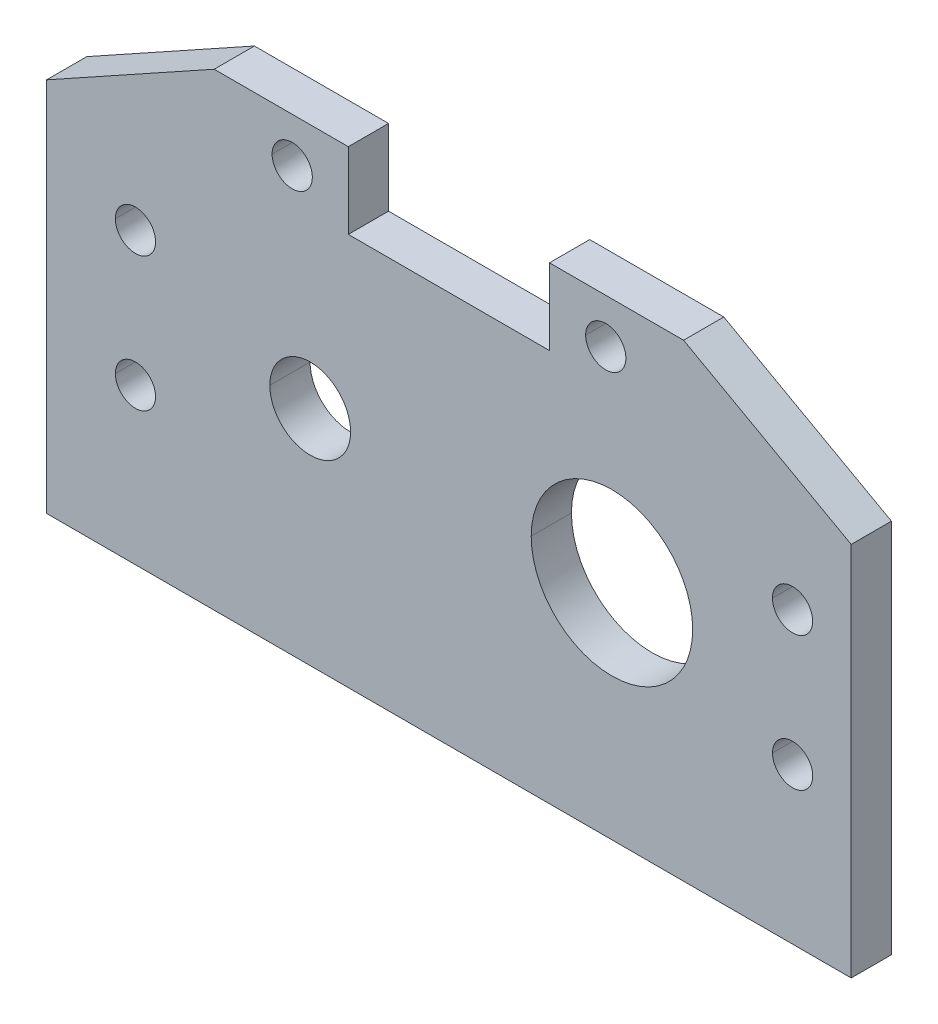
ISO-10303-21;
HEADER;
FILE_DESCRIPTION(('STEP AP214'),'2;1');
FILE_NAME('part.step','',(''),(''),'','','');
FILE_SCHEMA(('AUTOMOTIVE_DESIGN { 1 0 10303 214 1 1 1 1 }'));
ENDSEC;
DATA;
#1=APPLICATION_CONTEXT('core data for automotive mechanical design processes');
#2=APPLICATION_PROTOCOL_DEFINITION('international standard','automotive_design',2000,#1);
#3=PRODUCT_CONTEXT('',#1,'mechanical');
#4=PRODUCT('Part','Part','',(#3));
#5=PRODUCT_RELATED_PRODUCT_CATEGORY('part','',(#4));
#6=PRODUCT_DEFINITION_FORMATION('','',#4);
#7=PRODUCT_DEFINITION_CONTEXT('part definition',#1,'design');
#8=PRODUCT_DEFINITION('design','',#6,#7);
#9=PRODUCT_DEFINITION_SHAPE('','',#8);
#10=(LENGTH_UNIT() NAMED_UNIT(*) SI_UNIT(.MILLI.,.METRE.));
#11=(NAMED_UNIT(*) PLANE_ANGLE_UNIT() SI_UNIT($,.RADIAN.));
#12=(NAMED_UNIT(*) SI_UNIT($,.STERADIAN.) SOLID_ANGLE_UNIT());
#13=UNCERTAINTY_MEASURE_WITH_UNIT(LENGTH_MEASURE(1.E-05),#10,'distance_accuracy_value','');
#14=(GEOMETRIC_REPRESENTATION_CONTEXT(3) GLOBAL_UNCERTAINTY_ASSIGNED_CONTEXT((#13)) GLOBAL_UNIT_ASSIGNED_CONTEXT((#10,
#11,#12)) REPRESENTATION_CONTEXT('',''));
#15=CARTESIAN_POINT('',(0.,0.,0.));
#16=DIRECTION('',(0.,0.,1.));
#17=DIRECTION('',(1.,0.,0.));
#18=AXIS2_PLACEMENT_3D('',#15,#16,#17);
#19=CARTESIAN_POINT('',(12.1584471796846,-12.6693801884365,3.));
#20=DIRECTION('',(0.,0.,-1.));
#21=DIRECTION('',(-1.,0.,0.));
#22=AXIS2_PLACEMENT_3D('',#19,#20,#21);
#23=CYLINDRICAL_SURFACE('',#22,6.02039900736015);
#24=DIRECTION('',(0.,0.,-1.));
#25=VECTOR('',#24,1.);
#26=CARTESIAN_POINT('',(18.1788461870448,-12.6693801884365,3.));
#27=LINE('',#26,#25);
#28=CARTESIAN_POINT('',(18.1788461870448,-12.6693801884365,3.));
#29=VERTEX_POINT('',#28);
#30=CARTESIAN_POINT('',(18.1788461870448,-12.6693801884365,0.));
#31=VERTEX_POINT('',#30);
#32=EDGE_CURVE('E290',#29,#31,#27,.T.);
#33=ORIENTED_EDGE('',*,*,#32,.F.);
#34=CARTESIAN_POINT('',(12.1584471796846,-12.6693801884365,3.));
#35=DIRECTION('',(0.,0.,-1.));
#36=DIRECTION('',(-1.,0.,0.));
#37=AXIS2_PLACEMENT_3D('',#34,#35,#36);
#38=CIRCLE('',#37,6.02039900736015);
#39=CARTESIAN_POINT('',(6.13804817232444,-12.6693801884365,3.));
#40=VERTEX_POINT('',#39);
#41=EDGE_CURVE('E336',#40,#29,#38,.T.);
#42=ORIENTED_EDGE('',*,*,#41,.F.);
#43=DIRECTION('',(0.,0.,-1.));
#44=VECTOR('',#43,1.);
#45=CARTESIAN_POINT('',(6.13804817232444,-12.6693801884365,3.));
#46=LINE('',#45,#44);
#47=CARTESIAN_POINT('',(6.13804817232444,-12.6693801884365,0.));
#48=VERTEX_POINT('',#47);
#49=EDGE_CURVE('E308',#40,#48,#46,.T.);
#50=ORIENTED_EDGE('',*,*,#49,.T.);
#51=CARTESIAN_POINT('',(12.1584471796846,-12.6693801884365,0.));
#52=DIRECTION('',(0.,0.,-1.));
#53=DIRECTION('',(-1.,0.,0.));
#54=AXIS2_PLACEMENT_3D('',#51,#52,#53);
#55=CIRCLE('',#54,6.02039900736015);
#56=EDGE_CURVE('E347',#48,#31,#55,.T.);
#57=ORIENTED_EDGE('',*,*,#56,.T.);
#58=EDGE_LOOP('',(#33,#42,#50,#57));
#59=FACE_BOUND('',#58,.T.);
#60=ADVANCED_FACE('F16',(#59),#23,.F.);
#61=CARTESIAN_POINT('',(-10.3415528202247,-12.6693163131061,3.));
#62=DIRECTION('',(0.,0.,-1.));
#63=DIRECTION('',(-1.,0.,0.));
#64=AXIS2_PLACEMENT_3D('',#61,#62,#63);
#65=CYLINDRICAL_SURFACE('',#64,3.01);
#66=DIRECTION('',(0.,0.,-1.));
#67=VECTOR('',#66,1.);
#68=CARTESIAN_POINT('',(-7.3315528202247,-12.6693163131061,3.));
#69=LINE('',#68,#67);
#70=CARTESIAN_POINT('',(-7.3315528202247,-12.6693163131061,3.));
#71=VERTEX_POINT('',#70);
#72=CARTESIAN_POINT('',(-7.3315528202247,-12.6693163131061,0.));
#73=VERTEX_POINT('',#72);
#74=EDGE_CURVE('E323',#71,#73,#69,.T.);
#75=ORIENTED_EDGE('',*,*,#74,.F.);
#76=CARTESIAN_POINT('',(-10.3415528202247,-12.6693163131061,3.));
#77=DIRECTION('',(0.,0.,-1.));
#78=DIRECTION('',(-1.,0.,0.));
#79=AXIS2_PLACEMENT_3D('',#76,#77,#78);
#80=CIRCLE('',#79,3.01);
#81=CARTESIAN_POINT('',(-13.3515528202247,-12.6693163131061,3.));
#82=VERTEX_POINT('',#81);
#83=EDGE_CURVE('E377',#82,#71,#80,.T.);
#84=ORIENTED_EDGE('',*,*,#83,.F.);
#85=DIRECTION('',(0.,0.,-1.));
#86=VECTOR('',#85,1.);
#87=CARTESIAN_POINT('',(-13.3515528202247,-12.6693163131061,3.));
#88=LINE('',#87,#86);
#89=CARTESIAN_POINT('',(-13.3515528202247,-12.6693163131061,0.));
#90=VERTEX_POINT('',#89);
#91=EDGE_CURVE('E396',#82,#90,#88,.T.);
#92=ORIENTED_EDGE('',*,*,#91,.T.);
#93=CARTESIAN_POINT('',(-10.3415528202247,-12.6693163131061,0.));
#94=DIRECTION('',(0.,0.,-1.));
#95=DIRECTION('',(-1.,0.,0.));
#96=AXIS2_PLACEMENT_3D('',#93,#94,#95);
#97=CIRCLE('',#96,3.01);
#98=EDGE_CURVE('E239',#90,#73,#97,.T.);
#99=ORIENTED_EDGE('',*,*,#98,.T.);
#100=EDGE_LOOP('',(#75,#84,#92,#99));
#101=FACE_BOUND('',#100,.T.);
#102=ADVANCED_FACE('F541',(#101),#65,.F.);
#103=CARTESIAN_POINT('',(11.6968329642972,2.35034329740188,3.));
#104=DIRECTION('',(0.,0.,-1.));
#105=DIRECTION('',(-1.,0.,0.));
#106=AXIS2_PLACEMENT_3D('',#103,#104,#105);
#107=CYLINDRICAL_SURFACE('',#106,1.5);
#108=DIRECTION('',(0.,0.,-1.));
#109=VECTOR('',#108,1.);
#110=CARTESIAN_POINT('',(13.1968329642972,2.35034329740188,3.));
#111=LINE('',#110,#109);
#112=CARTESIAN_POINT('',(13.1968329642972,2.35034329740188,3.));
#113=VERTEX_POINT('',#112);
#114=CARTESIAN_POINT('',(13.1968329642972,2.35034329740188,0.));
#115=VERTEX_POINT('',#114);
#116=EDGE_CURVE('E388',#113,#115,#111,.T.);
#117=ORIENTED_EDGE('',*,*,#116,.F.);
#118=CARTESIAN_POINT('',(11.6968329642972,2.35034329740188,3.));
#119=DIRECTION('',(0.,0.,-1.));
#120=DIRECTION('',(-1.,0.,0.));
#121=AXIS2_PLACEMENT_3D('',#118,#119,#120);
#122=CIRCLE('',#121,1.5);
#123=CARTESIAN_POINT('',(10.1968329642972,2.35034329740188,3.));
#124=VERTEX_POINT('',#123);
#125=EDGE_CURVE('E228',#124,#113,#122,.T.);
#126=ORIENTED_EDGE('',*,*,#125,.F.);
#127=DIRECTION('',(0.,0.,-1.));
#128=VECTOR('',#127,1.);
#129=CARTESIAN_POINT('',(10.1968329642972,2.35034329740188,3.));
#130=LINE('',#129,#128);
#131=CARTESIAN_POINT('',(10.1968329642972,2.35034329740188,0.));
#132=VERTEX_POINT('',#131);
#133=EDGE_CURVE('E280',#124,#132,#130,.T.);
#134=ORIENTED_EDGE('',*,*,#133,.T.);
#135=CARTESIAN_POINT('',(11.6968329642972,2.35034329740188,0.));
#136=DIRECTION('',(0.,0.,-1.));
#137=DIRECTION('',(-1.,0.,0.));
#138=AXIS2_PLACEMENT_3D('',#135,#136,#137);
#139=CIRCLE('',#138,1.5);
#140=EDGE_CURVE('E300',#132,#115,#139,.T.);
#141=ORIENTED_EDGE('',*,*,#140,.T.);
#142=EDGE_LOOP('',(#117,#126,#134,#141));
#143=FACE_BOUND('',#142,.T.);
#144=ADVANCED_FACE('F839',(#143),#107,.F.);
#145=CARTESIAN_POINT('',(-11.6821646357028,2.35034329740185,3.));
#146=DIRECTION('',(0.,0.,-1.));
#147=DIRECTION('',(-1.,0.,0.));
#148=AXIS2_PLACEMENT_3D('',#145,#146,#147);
#149=CYLINDRICAL_SURFACE('',#148,1.5);
#150=DIRECTION('',(0.,0.,-1.));
#151=VECTOR('',#150,1.);
#152=CARTESIAN_POINT('',(-10.1821646357028,2.35034329740185,3.));
#153=LINE('',#152,#151);
#154=CARTESIAN_POINT('',(-10.1821646357028,2.35034329740185,3.));
#155=VERTEX_POINT('',#154);
#156=CARTESIAN_POINT('',(-10.1821646357028,2.35034329740185,0.));
#157=VERTEX_POINT('',#156);
#158=EDGE_CURVE('E404',#155,#157,#153,.T.);
#159=ORIENTED_EDGE('',*,*,#158,.F.);
#160=CARTESIAN_POINT('',(-11.6821646357028,2.35034329740185,3.));
#161=DIRECTION('',(0.,0.,-1.));
#162=DIRECTION('',(-1.,0.,0.));
#163=AXIS2_PLACEMENT_3D('',#160,#161,#162);
#164=CIRCLE('',#163,1.5);
#165=CARTESIAN_POINT('',(-13.1821646357028,2.35034329740185,3.));
#166=VERTEX_POINT('',#165);
#167=EDGE_CURVE('E376',#166,#155,#164,.T.);
#168=ORIENTED_EDGE('',*,*,#167,.F.);
#169=DIRECTION('',(0.,0.,-1.));
#170=VECTOR('',#169,1.);
#171=CARTESIAN_POINT('',(-13.1821646357028,2.35034329740185,3.));
#172=LINE('',#171,#170);
#173=CARTESIAN_POINT('',(-13.1821646357028,2.35034329740185,0.));
#174=VERTEX_POINT('',#173);
#175=EDGE_CURVE('E412',#166,#174,#172,.T.);
#176=ORIENTED_EDGE('',*,*,#175,.T.);
#177=CARTESIAN_POINT('',(-11.6821646357028,2.35034329740185,0.));
#178=DIRECTION('',(0.,0.,-1.));
#179=DIRECTION('',(-1.,0.,0.));
#180=AXIS2_PLACEMENT_3D('',#177,#178,#179);
#181=CIRCLE('',#180,1.5);
#182=EDGE_CURVE('E184',#174,#157,#181,.T.);
#183=ORIENTED_EDGE('',*,*,#182,.T.);
#184=EDGE_LOOP('',(#159,#168,#176,#183));
#185=FACE_BOUND('',#184,.T.);
#186=ADVANCED_FACE('F693',(#185),#149,.F.);
#187=CARTESIAN_POINT('',(25.6284471796847,-7.66938018843653,3.));
#188=DIRECTION('',(0.,0.,-1.));
#189=DIRECTION('',(-1.,0.,0.));
#190=AXIS2_PLACEMENT_3D('',#187,#188,#189);
#191=CYLINDRICAL_SURFACE('',#190,1.5);
#192=DIRECTION('',(0.,0.,-1.));
#193=VECTOR('',#192,1.);
#194=CARTESIAN_POINT('',(27.1284471796847,-7.66938018843653,3.));
#195=LINE('',#194,#193);
#196=CARTESIAN_POINT('',(27.1284471796847,-7.66938018843653,3.));
#197=VERTEX_POINT('',#196);
#198=CARTESIAN_POINT('',(27.1284471796847,-7.66938018843653,0.));
#199=VERTEX_POINT('',#198);
#200=EDGE_CURVE('E464',#197,#199,#195,.T.);
#201=ORIENTED_EDGE('',*,*,#200,.F.);
#202=CARTESIAN_POINT('',(25.6284471796847,-7.66938018843653,3.));
#203=DIRECTION('',(0.,0.,-1.));
#204=DIRECTION('',(-1.,0.,0.));
#205=AXIS2_PLACEMENT_3D('',#202,#203,#204);
#206=CIRCLE('',#205,1.5);
#207=CARTESIAN_POINT('',(24.1284471796846,-7.66938018843653,3.));
#208=VERTEX_POINT('',#207);
#209=EDGE_CURVE('E197',#208,#197,#206,.T.);
#210=ORIENTED_EDGE('',*,*,#209,.F.);
#211=DIRECTION('',(0.,0.,-1.));
#212=VECTOR('',#211,1.);
#213=CARTESIAN_POINT('',(24.1284471796846,-7.66938018843653,3.));
#214=LINE('',#213,#212);
#215=CARTESIAN_POINT('',(24.1284471796846,-7.66938018843653,0.));
#216=VERTEX_POINT('',#215);
#217=EDGE_CURVE('E346',#208,#216,#214,.T.);
#218=ORIENTED_EDGE('',*,*,#217,.T.);
#219=CARTESIAN_POINT('',(25.6284471796847,-7.66938018843653,0.));
#220=DIRECTION('',(0.,0.,-1.));
#221=DIRECTION('',(-1.,0.,0.));
#222=AXIS2_PLACEMENT_3D('',#219,#220,#221);
#223=CIRCLE('',#222,1.5);
#224=EDGE_CURVE('E304',#216,#199,#223,.T.);
#225=ORIENTED_EDGE('',*,*,#224,.T.);
#226=EDGE_LOOP('',(#201,#210,#218,#225));
#227=FACE_BOUND('',#226,.T.);
#228=ADVANCED_FACE('F688',(#227),#191,.F.);
#229=CARTESIAN_POINT('',(-23.3715528203154,-17.6693801884365,3.));
#230=DIRECTION('',(0.,0.,-1.));
#231=DIRECTION('',(-1.,0.,0.));
#232=AXIS2_PLACEMENT_3D('',#229,#230,#231);
#233=CYLINDRICAL_SURFACE('',#232,1.5);
#234=DIRECTION('',(0.,0.,-1.));
#235=VECTOR('',#234,1.);
#236=CARTESIAN_POINT('',(-21.8715528203154,-17.6693801884365,3.));
#237=LINE('',#236,#235);
#238=CARTESIAN_POINT('',(-21.8715528203154,-17.6693801884365,3.));
#239=VERTEX_POINT('',#238);
#240=CARTESIAN_POINT('',(-21.8715528203154,-17.6693801884365,0.));
#241=VERTEX_POINT('',#240);
#242=EDGE_CURVE('E337',#239,#241,#237,.T.);
#243=ORIENTED_EDGE('',*,*,#242,.F.);
#244=CARTESIAN_POINT('',(-23.3715528203154,-17.6693801884365,3.));
#245=DIRECTION('',(0.,0.,-1.));
#246=DIRECTION('',(-1.,0.,0.));
#247=AXIS2_PLACEMENT_3D('',#244,#245,#246);
#248=CIRCLE('',#247,1.5);
#249=CARTESIAN_POINT('',(-24.8715528203153,-17.6693801884365,3.));
#250=VERTEX_POINT('',#249);
#251=EDGE_CURVE('E415',#250,#239,#248,.T.);
#252=ORIENTED_EDGE('',*,*,#251,.F.);
#253=DIRECTION('',(0.,0.,-1.));
#254=VECTOR('',#253,1.);
#255=CARTESIAN_POINT('',(-24.8715528203153,-17.6693801884365,3.));
#256=LINE('',#255,#254);
#257=CARTESIAN_POINT('',(-24.8715528203153,-17.6693801884365,0.));
#258=VERTEX_POINT('',#257);
#259=EDGE_CURVE('E322',#250,#258,#256,.T.);
#260=ORIENTED_EDGE('',*,*,#259,.T.);
#261=CARTESIAN_POINT('',(-23.3715528203154,-17.6693801884365,0.));
#262=DIRECTION('',(0.,0.,-1.));
#263=DIRECTION('',(-1.,0.,0.));
#264=AXIS2_PLACEMENT_3D('',#261,#262,#263);
#265=CIRCLE('',#264,1.5);
#266=EDGE_CURVE('E307',#258,#241,#265,.T.);
#267=ORIENTED_EDGE('',*,*,#266,.T.);
#268=EDGE_LOOP('',(#243,#252,#260,#267));
#269=FACE_BOUND('',#268,.T.);
#270=ADVANCED_FACE('F662',(#269),#233,.F.);
#271=CARTESIAN_POINT('',(-23.3715528203154,-7.66938018843654,3.));
#272=DIRECTION('',(0.,0.,-1.));
#273=DIRECTION('',(-1.,0.,0.));
#274=AXIS2_PLACEMENT_3D('',#271,#272,#273);
#275=CYLINDRICAL_SURFACE('',#274,1.5);
#276=DIRECTION('',(0.,0.,-1.));
#277=VECTOR('',#276,1.);
#278=CARTESIAN_POINT('',(-21.8715528203154,-7.66938018843654,3.));
#279=LINE('',#278,#277);
#280=CARTESIAN_POINT('',(-21.8715528203154,-7.66938018843654,3.));
#281=VERTEX_POINT('',#280);
#282=CARTESIAN_POINT('',(-21.8715528203154,-7.66938018843654,0.));
#283=VERTEX_POINT('',#282);
#284=EDGE_CURVE('E291',#281,#283,#279,.T.);
#285=ORIENTED_EDGE('',*,*,#284,.F.);
#286=CARTESIAN_POINT('',(-23.3715528203154,-7.66938018843654,3.));
#287=DIRECTION('',(0.,0.,-1.));
#288=DIRECTION('',(-1.,0.,0.));
#289=AXIS2_PLACEMENT_3D('',#286,#287,#288);
#290=CIRCLE('',#289,1.5);
#291=CARTESIAN_POINT('',(-24.8715528203153,-7.66938018843654,3.));
#292=VERTEX_POINT('',#291);
#293=EDGE_CURVE('E418',#292,#281,#290,.T.);
#294=ORIENTED_EDGE('',*,*,#293,.F.);
#295=DIRECTION('',(0.,0.,-1.));
#296=VECTOR('',#295,1.);
#297=CARTESIAN_POINT('',(-24.8715528203153,-7.66938018843654,3.));
#298=LINE('',#297,#296);
#299=CARTESIAN_POINT('',(-24.8715528203153,-7.66938018843654,0.));
#300=VERTEX_POINT('',#299);
#301=EDGE_CURVE('E277',#292,#300,#298,.T.);
#302=ORIENTED_EDGE('',*,*,#301,.T.);
#303=CARTESIAN_POINT('',(-23.3715528203154,-7.66938018843654,0.));
#304=DIRECTION('',(0.,0.,-1.));
#305=DIRECTION('',(-1.,0.,0.));
#306=AXIS2_PLACEMENT_3D('',#303,#304,#305);
#307=CIRCLE('',#306,1.5);
#308=EDGE_CURVE('E27',#300,#283,#307,.T.);
#309=ORIENTED_EDGE('',*,*,#308,.T.);
#310=EDGE_LOOP('',(#285,#294,#302,#309));
#311=FACE_BOUND('',#310,.T.);
#312=ADVANCED_FACE('F657',(#311),#275,.F.);
#313=CARTESIAN_POINT('',(25.6284471796847,-17.6693801884365,3.));
#314=DIRECTION('',(0.,0.,-1.));
#315=DIRECTION('',(-1.,0.,0.));
#316=AXIS2_PLACEMENT_3D('',#313,#314,#315);
#317=CYLINDRICAL_SURFACE('',#316,1.5);
#318=DIRECTION('',(0.,0.,-1.));
#319=VECTOR('',#318,1.);
#320=CARTESIAN_POINT('',(27.1284471796847,-17.6693801884365,3.));
#321=LINE('',#320,#319);
#322=CARTESIAN_POINT('',(27.1284471796847,-17.6693801884365,3.));
#323=VERTEX_POINT('',#322);
#324=CARTESIAN_POINT('',(27.1284471796847,-17.6693801884365,0.));
#325=VERTEX_POINT('',#324);
#326=EDGE_CURVE('E259',#323,#325,#321,.T.);
#327=ORIENTED_EDGE('',*,*,#326,.F.);
#328=CARTESIAN_POINT('',(25.6284471796847,-17.6693801884365,3.));
#329=DIRECTION('',(0.,0.,-1.));
#330=DIRECTION('',(-1.,0.,0.));
#331=AXIS2_PLACEMENT_3D('',#328,#329,#330);
#332=CIRCLE('',#331,1.5);
#333=CARTESIAN_POINT('',(24.1284471796846,-17.6693801884365,3.));
#334=VERTEX_POINT('',#333);
#335=EDGE_CURVE('E252',#334,#323,#332,.T.);
#336=ORIENTED_EDGE('',*,*,#335,.F.);
#337=DIRECTION('',(0.,0.,-1.));
#338=VECTOR('',#337,1.);
#339=CARTESIAN_POINT('',(24.1284471796846,-17.6693801884365,3.));
#340=LINE('',#339,#338);
#341=CARTESIAN_POINT('',(24.1284471796846,-17.6693801884365,0.));
#342=VERTEX_POINT('',#341);
#343=EDGE_CURVE('E20',#334,#342,#340,.T.);
#344=ORIENTED_EDGE('',*,*,#343,.T.);
#345=CARTESIAN_POINT('',(25.6284471796847,-17.6693801884365,0.));
#346=DIRECTION('',(0.,0.,-1.));
#347=DIRECTION('',(-1.,0.,0.));
#348=AXIS2_PLACEMENT_3D('',#345,#346,#347);
#349=CIRCLE('',#348,1.5);
#350=EDGE_CURVE('E11',#342,#325,#349,.T.);
#351=ORIENTED_EDGE('',*,*,#350,.T.);
#352=EDGE_LOOP('',(#327,#336,#344,#351));
#353=FACE_BOUND('',#352,.T.);
#354=ADVANCED_FACE('F257',(#353),#317,.F.);
#355=CARTESIAN_POINT('',(0.,0.,0.));
#356=DIRECTION('',(0.,0.,-1.));
#357=DIRECTION('',(0.,-1.,0.));
#358=AXIS2_PLACEMENT_3D('',#355,#356,#357);
#359=PLANE('',#358);
#360=ORIENTED_EDGE('',*,*,#350,.F.);
#361=CARTESIAN_POINT('',(25.6284471796847,-17.6693801884365,0.));
#362=DIRECTION('',(0.,0.,-1.));
#363=DIRECTION('',(-1.,0.,0.));
#364=AXIS2_PLACEMENT_3D('',#361,#362,#363);
#365=CIRCLE('',#364,1.5);
#366=EDGE_CURVE('E263',#325,#342,#365,.T.);
#367=ORIENTED_EDGE('',*,*,#366,.F.);
#368=EDGE_LOOP('',(#360,#367));
#369=FACE_BOUND('',#368,.T.);
#370=ORIENTED_EDGE('',*,*,#308,.F.);
#371=CARTESIAN_POINT('',(-23.3715528203154,-7.66938018843654,0.));
#372=DIRECTION('',(0.,0.,-1.));
#373=DIRECTION('',(-1.,0.,0.));
#374=AXIS2_PLACEMENT_3D('',#371,#372,#373);
#375=CIRCLE('',#374,1.5);
#376=EDGE_CURVE('E295',#283,#300,#375,.T.);
#377=ORIENTED_EDGE('',*,*,#376,.F.);
#378=EDGE_LOOP('',(#370,#377));
#379=FACE_BOUND('',#378,.T.);
#380=ORIENTED_EDGE('',*,*,#266,.F.);
#381=CARTESIAN_POINT('',(-23.3715528203154,-17.6693801884365,0.));
#382=DIRECTION('',(0.,0.,-1.));
#383=DIRECTION('',(-1.,0.,0.));
#384=AXIS2_PLACEMENT_3D('',#381,#382,#383);
#385=CIRCLE('',#384,1.5);
#386=EDGE_CURVE('E341',#241,#258,#385,.T.);
#387=ORIENTED_EDGE('',*,*,#386,.F.);
#388=EDGE_LOOP('',(#380,#387));
#389=FACE_BOUND('',#388,.T.);
#390=ORIENTED_EDGE('',*,*,#224,.F.);
#391=CARTESIAN_POINT('',(25.6284471796847,-7.66938018843653,0.));
#392=DIRECTION('',(0.,0.,-1.));
#393=DIRECTION('',(-1.,0.,0.));
#394=AXIS2_PLACEMENT_3D('',#391,#392,#393);
#395=CIRCLE('',#394,1.5);
#396=EDGE_CURVE('E468',#199,#216,#395,.T.);
#397=ORIENTED_EDGE('',*,*,#396,.F.);
#398=EDGE_LOOP('',(#390,#397));
#399=FACE_BOUND('',#398,.T.);
#400=ORIENTED_EDGE('',*,*,#182,.F.);
#401=CARTESIAN_POINT('',(-11.6821646357028,2.35034329740185,0.));
#402=DIRECTION('',(0.,0.,-1.));
#403=DIRECTION('',(-1.,0.,0.));
#404=AXIS2_PLACEMENT_3D('',#401,#402,#403);
#405=CIRCLE('',#404,1.5);
#406=EDGE_CURVE('E408',#157,#174,#405,.T.);
#407=ORIENTED_EDGE('',*,*,#406,.F.);
#408=EDGE_LOOP('',(#400,#407));
#409=FACE_BOUND('',#408,.T.);
#410=ORIENTED_EDGE('',*,*,#140,.F.);
#411=CARTESIAN_POINT('',(11.6968329642972,2.35034329740188,0.));
#412=DIRECTION('',(0.,0.,-1.));
#413=DIRECTION('',(-1.,0.,0.));
#414=AXIS2_PLACEMENT_3D('',#411,#412,#413);
#415=CIRCLE('',#414,1.5);
#416=EDGE_CURVE('E285',#115,#132,#415,.T.);
#417=ORIENTED_EDGE('',*,*,#416,.F.);
#418=EDGE_LOOP('',(#410,#417));
#419=FACE_BOUND('',#418,.T.);
#420=ORIENTED_EDGE('',*,*,#98,.F.);
#421=CARTESIAN_POINT('',(-10.3415528202247,-12.6693163131061,0.));
#422=DIRECTION('',(0.,0.,-1.));
#423=DIRECTION('',(-1.,0.,0.));
#424=AXIS2_PLACEMENT_3D('',#421,#422,#423);
#425=CIRCLE('',#424,3.01);
#426=EDGE_CURVE('E327',#73,#90,#425,.T.);
#427=ORIENTED_EDGE('',*,*,#426,.F.);
#428=EDGE_LOOP('',(#420,#427));
#429=FACE_BOUND('',#428,.T.);
#430=ORIENTED_EDGE('',*,*,#56,.F.);
#431=CARTESIAN_POINT('',(12.1584471796846,-12.6693801884365,0.));
#432=DIRECTION('',(0.,0.,-1.));
#433=DIRECTION('',(-1.,0.,0.));
#434=AXIS2_PLACEMENT_3D('',#431,#432,#433);
#435=CIRCLE('',#434,6.02039900736015);
#436=EDGE_CURVE('E313',#31,#48,#435,.T.);
#437=ORIENTED_EDGE('',*,*,#436,.F.);
#438=EDGE_LOOP('',(#430,#437));
#439=FACE_BOUND('',#438,.T.);
#440=DIRECTION('',(0.,-1.,0.));
#441=VECTOR('',#440,1.);
#442=CARTESIAN_POINT('',(7.5,0.,0.));
#443=LINE('',#442,#441);
#444=CARTESIAN_POINT('',(7.5,5.66583768810425,0.));
#445=VERTEX_POINT('',#444);
#446=CARTESIAN_POINT('',(7.5,0.,0.));
#447=VERTEX_POINT('',#446);
#448=EDGE_CURVE('E443',#445,#447,#443,.T.);
#449=ORIENTED_EDGE('',*,*,#448,.F.);
#450=DIRECTION('',(-1.,0.,0.));
#451=VECTOR('',#450,1.);
#452=CARTESIAN_POINT('',(7.5,5.66583768810425,0.));
#453=LINE('',#452,#451);
#454=CARTESIAN_POINT('',(17.5,5.66583768810425,0.));
#455=VERTEX_POINT('',#454);
#456=EDGE_CURVE('E316',#455,#445,#453,.T.);
#457=ORIENTED_EDGE('',*,*,#456,.F.);
#458=DIRECTION('',(-0.874433040084828,0.485146223738787,0.));
#459=VECTOR('',#458,1.);
#460=CARTESIAN_POINT('',(17.5,5.66583768810425,0.));
#461=LINE('',#460,#459);
#462=CARTESIAN_POINT('',(30.,-1.26931631310611,0.));
#463=VERTEX_POINT('',#462);
#464=EDGE_CURVE('E435',#463,#455,#461,.T.);
#465=ORIENTED_EDGE('',*,*,#464,.F.);
#466=DIRECTION('',(0.,1.,0.));
#467=VECTOR('',#466,1.);
#468=CARTESIAN_POINT('',(30.,-1.26931631310611,0.));
#469=LINE('',#468,#467);
#470=CARTESIAN_POINT('',(30.,-29.2693163131061,0.));
#471=VERTEX_POINT('',#470);
#472=EDGE_CURVE('E119',#471,#463,#469,.T.);
#473=ORIENTED_EDGE('',*,*,#472,.F.);
#474=DIRECTION('',(1.,0.,0.));
#475=VECTOR('',#474,1.);
#476=CARTESIAN_POINT('',(30.,-29.2693163131061,0.));
#477=LINE('',#476,#475);
#478=CARTESIAN_POINT('',(-30.,-29.2693163131061,0.));
#479=VERTEX_POINT('',#478);
#480=EDGE_CURVE('E378',#479,#471,#477,.T.);
#481=ORIENTED_EDGE('',*,*,#480,.F.);
#482=DIRECTION('',(0.,-1.,0.));
#483=VECTOR('',#482,1.);
#484=CARTESIAN_POINT('',(-30.,-1.26931631310612,0.));
#485=LINE('',#484,#483);
#486=CARTESIAN_POINT('',(-30.,-1.26931631310612,0.));
#487=VERTEX_POINT('',#486);
#488=EDGE_CURVE('E364',#487,#479,#485,.T.);
#489=ORIENTED_EDGE('',*,*,#488,.F.);
#490=DIRECTION('',(-0.874433040084828,-0.485146223738787,0.));
#491=VECTOR('',#490,1.);
#492=CARTESIAN_POINT('',(-17.5,5.66583768810424,0.));
#493=LINE('',#492,#491);
#494=CARTESIAN_POINT('',(-17.5,5.66583768810424,0.));
#495=VERTEX_POINT('',#494);
#496=EDGE_CURVE('E373',#495,#487,#493,.T.);
#497=ORIENTED_EDGE('',*,*,#496,.F.);
#498=DIRECTION('',(-1.,0.,0.));
#499=VECTOR('',#498,1.);
#500=CARTESIAN_POINT('',(-7.5,5.66583768810425,0.));
#501=LINE('',#500,#499);
#502=CARTESIAN_POINT('',(-7.5,5.66583768810425,0.));
#503=VERTEX_POINT('',#502);
#504=EDGE_CURVE('E361',#503,#495,#501,.T.);
#505=ORIENTED_EDGE('',*,*,#504,.F.);
#506=DIRECTION('',(0.,1.,0.));
#507=VECTOR('',#506,1.);
#508=CARTESIAN_POINT('',(-7.5,0.,0.));
#509=LINE('',#508,#507);
#510=CARTESIAN_POINT('',(-7.5,0.,0.));
#511=VERTEX_POINT('',#510);
#512=EDGE_CURVE('E332',#511,#503,#509,.T.);
#513=ORIENTED_EDGE('',*,*,#512,.F.);
#514=DIRECTION('',(-1.,0.,0.));
#515=VECTOR('',#514,1.);
#516=CARTESIAN_POINT('',(-7.5,0.,0.));
#517=LINE('',#516,#515);
#518=EDGE_CURVE('E427',#447,#511,#517,.T.);
#519=ORIENTED_EDGE('',*,*,#518,.F.);
#520=EDGE_LOOP('',(#449,#457,#465,#473,#481,#489,#497,#505,#513,#519));
#521=FACE_BOUND('',#520,.T.);
#522=ADVANCED_FACE('F264',(#369,#379,#389,#399,#409,#419,#429,#439,#521),#359,.T.);
#523=CARTESIAN_POINT('',(0.,0.,3.));
#524=DIRECTION('',(0.,0.,-1.));
#525=DIRECTION('',(0.,-1.,0.));
#526=AXIS2_PLACEMENT_3D('',#523,#524,#525);
#527=PLANE('',#526);
#528=ORIENTED_EDGE('',*,*,#335,.T.);
#529=CARTESIAN_POINT('',(25.6284471796847,-17.6693801884365,3.));
#530=DIRECTION('',(0.,0.,-1.));
#531=DIRECTION('',(-1.,0.,0.));
#532=AXIS2_PLACEMENT_3D('',#529,#530,#531);
#533=CIRCLE('',#532,1.5);
#534=EDGE_CURVE('E271',#323,#334,#533,.T.);
#535=ORIENTED_EDGE('',*,*,#534,.T.);
#536=EDGE_LOOP('',(#528,#535));
#537=FACE_BOUND('',#536,.T.);
#538=ORIENTED_EDGE('',*,*,#293,.T.);
#539=CARTESIAN_POINT('',(-23.3715528203154,-7.66938018843654,3.));
#540=DIRECTION('',(0.,0.,-1.));
#541=DIRECTION('',(-1.,0.,0.));
#542=AXIS2_PLACEMENT_3D('',#539,#540,#541);
#543=CIRCLE('',#542,1.5);
#544=EDGE_CURVE('E296',#281,#292,#543,.T.);
#545=ORIENTED_EDGE('',*,*,#544,.T.);
#546=EDGE_LOOP('',(#538,#545));
#547=FACE_BOUND('',#546,.T.);
#548=ORIENTED_EDGE('',*,*,#251,.T.);
#549=CARTESIAN_POINT('',(-23.3715528203154,-17.6693801884365,3.));
#550=DIRECTION('',(0.,0.,-1.));
#551=DIRECTION('',(-1.,0.,0.));
#552=AXIS2_PLACEMENT_3D('',#549,#550,#551);
#553=CIRCLE('',#552,1.5);
#554=EDGE_CURVE('E342',#239,#250,#553,.T.);
#555=ORIENTED_EDGE('',*,*,#554,.T.);
#556=EDGE_LOOP('',(#548,#555));
#557=FACE_BOUND('',#556,.T.);
#558=ORIENTED_EDGE('',*,*,#209,.T.);
#559=CARTESIAN_POINT('',(25.6284471796847,-7.66938018843653,3.));
#560=DIRECTION('',(0.,0.,-1.));
#561=DIRECTION('',(-1.,0.,0.));
#562=AXIS2_PLACEMENT_3D('',#559,#560,#561);
#563=CIRCLE('',#562,1.5);
#564=EDGE_CURVE('E469',#197,#208,#563,.T.);
#565=ORIENTED_EDGE('',*,*,#564,.T.);
#566=EDGE_LOOP('',(#558,#565));
#567=FACE_BOUND('',#566,.T.);
#568=ORIENTED_EDGE('',*,*,#167,.T.);
#569=CARTESIAN_POINT('',(-11.6821646357028,2.35034329740185,3.));
#570=DIRECTION('',(0.,0.,-1.));
#571=DIRECTION('',(-1.,0.,0.));
#572=AXIS2_PLACEMENT_3D('',#569,#570,#571);
#573=CIRCLE('',#572,1.5);
#574=EDGE_CURVE('E284',#155,#166,#573,.T.);
#575=ORIENTED_EDGE('',*,*,#574,.T.);
#576=EDGE_LOOP('',(#568,#575));
#577=FACE_BOUND('',#576,.T.);
#578=ORIENTED_EDGE('',*,*,#125,.T.);
#579=CARTESIAN_POINT('',(11.6968329642972,2.35034329740188,3.));
#580=DIRECTION('',(0.,0.,-1.));
#581=DIRECTION('',(-1.,0.,0.));
#582=AXIS2_PLACEMENT_3D('',#579,#580,#581);
#583=CIRCLE('',#582,1.5);
#584=EDGE_CURVE('E392',#113,#124,#583,.T.);
#585=ORIENTED_EDGE('',*,*,#584,.T.);
#586=EDGE_LOOP('',(#578,#585));
#587=FACE_BOUND('',#586,.T.);
#588=ORIENTED_EDGE('',*,*,#83,.T.);
#589=CARTESIAN_POINT('',(-10.3415528202247,-12.6693163131061,3.));
#590=DIRECTION('',(0.,0.,-1.));
#591=DIRECTION('',(-1.,0.,0.));
#592=AXIS2_PLACEMENT_3D('',#589,#590,#591);
#593=CIRCLE('',#592,3.01);
#594=EDGE_CURVE('E312',#71,#82,#593,.T.);
#595=ORIENTED_EDGE('',*,*,#594,.T.);
#596=EDGE_LOOP('',(#588,#595));
#597=FACE_BOUND('',#596,.T.);
#598=ORIENTED_EDGE('',*,*,#41,.T.);
#599=CARTESIAN_POINT('',(12.1584471796846,-12.6693801884365,3.));
#600=DIRECTION('',(0.,0.,-1.));
#601=DIRECTION('',(-1.,0.,0.));
#602=AXIS2_PLACEMENT_3D('',#599,#600,#601);
#603=CIRCLE('',#602,6.02039900736015);
#604=EDGE_CURVE('E286',#29,#40,#603,.T.);
#605=ORIENTED_EDGE('',*,*,#604,.T.);
#606=EDGE_LOOP('',(#598,#605));
#607=FACE_BOUND('',#606,.T.);
#608=DIRECTION('',(0.,-1.,0.));
#609=VECTOR('',#608,1.);
#610=CARTESIAN_POINT('',(7.5,0.,3.));
#611=LINE('',#610,#609);
#612=CARTESIAN_POINT('',(7.5,5.66583768810425,3.));
#613=VERTEX_POINT('',#612);
#614=CARTESIAN_POINT('',(7.5,0.,3.));
#615=VERTEX_POINT('',#614);
#616=EDGE_CURVE('E428',#613,#615,#611,.T.);
#617=ORIENTED_EDGE('',*,*,#616,.T.);
#618=DIRECTION('',(-1.,0.,0.));
#619=VECTOR('',#618,1.);
#620=CARTESIAN_POINT('',(-7.5,0.,3.));
#621=LINE('',#620,#619);
#622=CARTESIAN_POINT('',(-7.5,0.,3.));
#623=VERTEX_POINT('',#622);
#624=EDGE_CURVE('E328',#615,#623,#621,.T.);
#625=ORIENTED_EDGE('',*,*,#624,.T.);
#626=DIRECTION('',(0.,1.,0.));
#627=VECTOR('',#626,1.);
#628=CARTESIAN_POINT('',(-7.5,0.,3.));
#629=LINE('',#628,#627);
#630=CARTESIAN_POINT('',(-7.5,5.66583768810425,3.));
#631=VERTEX_POINT('',#630);
#632=EDGE_CURVE('E422',#623,#631,#629,.T.);
#633=ORIENTED_EDGE('',*,*,#632,.T.);
#634=DIRECTION('',(-1.,0.,0.));
#635=VECTOR('',#634,1.);
#636=CARTESIAN_POINT('',(-7.5,5.66583768810425,3.));
#637=LINE('',#636,#635);
#638=CARTESIAN_POINT('',(-17.5,5.66583768810424,3.));
#639=VERTEX_POINT('',#638);
#640=EDGE_CURVE('E360',#631,#639,#637,.T.);
#641=ORIENTED_EDGE('',*,*,#640,.T.);
#642=DIRECTION('',(-0.874433040084828,-0.485146223738787,0.));
#643=VECTOR('',#642,1.);
#644=CARTESIAN_POINT('',(-17.5,5.66583768810424,3.));
#645=LINE('',#644,#643);
#646=CARTESIAN_POINT('',(-30.,-1.26931631310612,3.));
#647=VERTEX_POINT('',#646);
#648=EDGE_CURVE('E369',#639,#647,#645,.T.);
#649=ORIENTED_EDGE('',*,*,#648,.T.);
#650=DIRECTION('',(0.,-1.,0.));
#651=VECTOR('',#650,1.);
#652=CARTESIAN_POINT('',(-30.,-1.26931631310612,3.));
#653=LINE('',#652,#651);
#654=CARTESIAN_POINT('',(-30.,-29.2693163131061,3.));
#655=VERTEX_POINT('',#654);
#656=EDGE_CURVE('E383',#647,#655,#653,.T.);
#657=ORIENTED_EDGE('',*,*,#656,.T.);
#658=DIRECTION('',(1.,0.,0.));
#659=VECTOR('',#658,1.);
#660=CARTESIAN_POINT('',(30.,-29.2693163131061,3.));
#661=LINE('',#660,#659);
#662=CARTESIAN_POINT('',(30.,-29.2693163131061,3.));
#663=VERTEX_POINT('',#662);
#664=EDGE_CURVE('E133',#655,#663,#661,.T.);
#665=ORIENTED_EDGE('',*,*,#664,.T.);
#666=DIRECTION('',(0.,1.,0.));
#667=VECTOR('',#666,1.);
#668=CARTESIAN_POINT('',(30.,-1.26931631310611,3.));
#669=LINE('',#668,#667);
#670=CARTESIAN_POINT('',(30.,-1.26931631310611,3.));
#671=VERTEX_POINT('',#670);
#672=EDGE_CURVE('E401',#663,#671,#669,.T.);
#673=ORIENTED_EDGE('',*,*,#672,.T.);
#674=DIRECTION('',(-0.874433040084828,0.485146223738787,0.));
#675=VECTOR('',#674,1.);
#676=CARTESIAN_POINT('',(17.5,5.66583768810425,3.));
#677=LINE('',#676,#675);
#678=CARTESIAN_POINT('',(17.5,5.66583768810425,3.));
#679=VERTEX_POINT('',#678);
#680=EDGE_CURVE('E314',#671,#679,#677,.T.);
#681=ORIENTED_EDGE('',*,*,#680,.T.);
#682=DIRECTION('',(-1.,0.,0.));
#683=VECTOR('',#682,1.);
#684=CARTESIAN_POINT('',(7.5,5.66583768810425,3.));
#685=LINE('',#684,#683);
#686=EDGE_CURVE('E42',#679,#613,#685,.T.);
#687=ORIENTED_EDGE('',*,*,#686,.T.);
#688=EDGE_LOOP('',(#617,#625,#633,#641,#649,#657,#665,#673,#681,#687));
#689=FACE_BOUND('',#688,.T.);
#690=ADVANCED_FACE('F547',(#537,#547,#557,#567,#577,#587,#597,#607,#689),#527,.F.);
#691=CARTESIAN_POINT('',(7.5,5.66583768810425,3.));
#692=DIRECTION('',(0.,-1.,0.));
#693=DIRECTION('',(0.,0.,-1.));
#694=AXIS2_PLACEMENT_3D('',#691,#692,#693);
#695=PLANE('',#694);
#696=ORIENTED_EDGE('',*,*,#456,.T.);
#697=DIRECTION('',(0.,0.,-1.));
#698=VECTOR('',#697,1.);
#699=CARTESIAN_POINT('',(7.5,5.66583768810425,3.));
#700=LINE('',#699,#698);
#701=EDGE_CURVE('E423',#613,#445,#700,.T.);
#702=ORIENTED_EDGE('',*,*,#701,.F.);
#703=ORIENTED_EDGE('',*,*,#686,.F.);
#704=DIRECTION('',(0.,0.,-1.));
#705=VECTOR('',#704,1.);
#706=CARTESIAN_POINT('',(17.5,5.66583768810425,3.));
#707=LINE('',#706,#705);
#708=EDGE_CURVE('E317',#679,#455,#707,.T.);
#709=ORIENTED_EDGE('',*,*,#708,.T.);
#710=EDGE_LOOP('',(#696,#702,#703,#709));
#711=FACE_BOUND('',#710,.T.);
#712=ADVANCED_FACE('F708',(#711),#695,.F.);
#713=CARTESIAN_POINT('',(17.5,5.66583768810425,3.));
#714=DIRECTION('',(-0.485146223738787,-0.874433040084828,0.));
#715=DIRECTION('',(-0.874433040084828,0.485146223738787,0.));
#716=AXIS2_PLACEMENT_3D('',#713,#714,#715);
#717=PLANE('',#716);
#718=ORIENTED_EDGE('',*,*,#464,.T.);
#719=ORIENTED_EDGE('',*,*,#708,.F.);
#720=ORIENTED_EDGE('',*,*,#680,.F.);
#721=DIRECTION('',(0.,0.,-1.));
#722=VECTOR('',#721,1.);
#723=CARTESIAN_POINT('',(30.,-1.26931631310611,3.));
#724=LINE('',#723,#722);
#725=EDGE_CURVE('E397',#671,#463,#724,.T.);
#726=ORIENTED_EDGE('',*,*,#725,.T.);
#727=EDGE_LOOP('',(#718,#719,#720,#726));
#728=FACE_BOUND('',#727,.T.);
#729=ADVANCED_FACE('F702',(#728),#717,.F.);
#730=CARTESIAN_POINT('',(30.,-1.26931631310611,3.));
#731=DIRECTION('',(-1.,0.,0.));
#732=DIRECTION('',(0.,1.,0.));
#733=AXIS2_PLACEMENT_3D('',#730,#731,#732);
#734=PLANE('',#733);
#735=ORIENTED_EDGE('',*,*,#472,.T.);
#736=ORIENTED_EDGE('',*,*,#725,.F.);
#737=ORIENTED_EDGE('',*,*,#672,.F.);
#738=DIRECTION('',(0.,0.,-1.));
#739=VECTOR('',#738,1.);
#740=CARTESIAN_POINT('',(30.,-29.2693163131061,3.));
#741=LINE('',#740,#739);
#742=EDGE_CURVE('E382',#663,#471,#741,.T.);
#743=ORIENTED_EDGE('',*,*,#742,.T.);
#744=EDGE_LOOP('',(#735,#736,#737,#743));
#745=FACE_BOUND('',#744,.T.);
#746=ADVANCED_FACE('F707',(#745),#734,.F.);
#747=CARTESIAN_POINT('',(30.,-29.2693163131061,3.));
#748=DIRECTION('',(0.,1.,0.));
#749=DIRECTION('',(1.,0.,0.));
#750=AXIS2_PLACEMENT_3D('',#747,#748,#749);
#751=PLANE('',#750);
#752=ORIENTED_EDGE('',*,*,#480,.T.);
#753=ORIENTED_EDGE('',*,*,#742,.F.);
#754=ORIENTED_EDGE('',*,*,#664,.F.);
#755=DIRECTION('',(0.,0.,-1.));
#756=VECTOR('',#755,1.);
#757=CARTESIAN_POINT('',(-30.,-29.2693163131061,3.));
#758=LINE('',#757,#756);
#759=EDGE_CURVE('E368',#655,#479,#758,.T.);
#760=ORIENTED_EDGE('',*,*,#759,.T.);
#761=EDGE_LOOP('',(#752,#753,#754,#760));
#762=FACE_BOUND('',#761,.T.);
#763=ADVANCED_FACE('F721',(#762),#751,.F.);
#764=CARTESIAN_POINT('',(-30.,-1.26931631310612,3.));
#765=DIRECTION('',(1.,0.,0.));
#766=DIRECTION('',(0.,1.,0.));
#767=AXIS2_PLACEMENT_3D('',#764,#765,#766);
#768=PLANE('',#767);
#769=ORIENTED_EDGE('',*,*,#488,.T.);
#770=ORIENTED_EDGE('',*,*,#759,.F.);
#771=ORIENTED_EDGE('',*,*,#656,.F.);
#772=DIRECTION('',(0.,0.,-1.));
#773=VECTOR('',#772,1.);
#774=CARTESIAN_POINT('',(-30.,-1.26931631310612,3.));
#775=LINE('',#774,#773);
#776=EDGE_CURVE('E387',#647,#487,#775,.T.);
#777=ORIENTED_EDGE('',*,*,#776,.T.);
#778=EDGE_LOOP('',(#769,#770,#771,#777));
#779=FACE_BOUND('',#778,.T.);
#780=ADVANCED_FACE('F678',(#779),#768,.F.);
#781=CARTESIAN_POINT('',(-17.5,5.66583768810424,3.));
#782=DIRECTION('',(0.485146223738787,-0.874433040084828,0.));
#783=DIRECTION('',(0.,0.,-1.));
#784=AXIS2_PLACEMENT_3D('',#781,#782,#783);
#785=PLANE('',#784);
#786=ORIENTED_EDGE('',*,*,#496,.T.);
#787=ORIENTED_EDGE('',*,*,#776,.F.);
#788=ORIENTED_EDGE('',*,*,#648,.F.);
#789=DIRECTION('',(0.,0.,-1.));
#790=VECTOR('',#789,1.);
#791=CARTESIAN_POINT('',(-17.5,5.66583768810424,3.));
#792=LINE('',#791,#790);
#793=EDGE_CURVE('E356',#639,#495,#792,.T.);
#794=ORIENTED_EDGE('',*,*,#793,.T.);
#795=EDGE_LOOP('',(#786,#787,#788,#794));
#796=FACE_BOUND('',#795,.T.);
#797=ADVANCED_FACE('F672',(#796),#785,.F.);
#798=CARTESIAN_POINT('',(-7.5,5.66583768810425,3.));
#799=DIRECTION('',(0.,-1.,0.));
#800=DIRECTION('',(0.,0.,-1.));
#801=AXIS2_PLACEMENT_3D('',#798,#799,#800);
#802=PLANE('',#801);
#803=ORIENTED_EDGE('',*,*,#504,.T.);
#804=ORIENTED_EDGE('',*,*,#793,.F.);
#805=ORIENTED_EDGE('',*,*,#640,.F.);
#806=DIRECTION('',(0.,0.,-1.));
#807=VECTOR('',#806,1.);
#808=CARTESIAN_POINT('',(-7.5,5.66583768810425,3.));
#809=LINE('',#808,#807);
#810=EDGE_CURVE('E355',#631,#503,#809,.T.);
#811=ORIENTED_EDGE('',*,*,#810,.T.);
#812=EDGE_LOOP('',(#803,#804,#805,#811));
#813=FACE_BOUND('',#812,.T.);
#814=ADVANCED_FACE('F677',(#813),#802,.F.);
#815=CARTESIAN_POINT('',(-7.5,0.,3.));
#816=DIRECTION('',(-1.,0.,0.));
#817=DIRECTION('',(0.,0.,1.));
#818=AXIS2_PLACEMENT_3D('',#815,#816,#817);
#819=PLANE('',#818);
#820=ORIENTED_EDGE('',*,*,#512,.T.);
#821=ORIENTED_EDGE('',*,*,#810,.F.);
#822=ORIENTED_EDGE('',*,*,#632,.F.);
#823=DIRECTION('',(0.,0.,-1.));
#824=VECTOR('',#823,1.);
#825=CARTESIAN_POINT('',(-7.5,0.,3.));
#826=LINE('',#825,#824);
#827=EDGE_CURVE('E333',#623,#511,#826,.T.);
#828=ORIENTED_EDGE('',*,*,#827,.T.);
#829=EDGE_LOOP('',(#820,#821,#822,#828));
#830=FACE_BOUND('',#829,.T.);
#831=ADVANCED_FACE('F647',(#830),#819,.F.);
#832=CARTESIAN_POINT('',(-7.5,0.,3.));
#833=DIRECTION('',(0.,-1.,0.));
#834=DIRECTION('',(0.,0.,-1.));
#835=AXIS2_PLACEMENT_3D('',#832,#833,#834);
#836=PLANE('',#835);
#837=ORIENTED_EDGE('',*,*,#518,.T.);
#838=ORIENTED_EDGE('',*,*,#827,.F.);
#839=ORIENTED_EDGE('',*,*,#624,.F.);
#840=DIRECTION('',(0.,0.,-1.));
#841=VECTOR('',#840,1.);
#842=CARTESIAN_POINT('',(7.5,0.,3.));
#843=LINE('',#842,#841);
#844=EDGE_CURVE('E439',#615,#447,#843,.T.);
#845=ORIENTED_EDGE('',*,*,#844,.T.);
#846=EDGE_LOOP('',(#837,#838,#839,#845));
#847=FACE_BOUND('',#846,.T.);
#848=ADVANCED_FACE('F642',(#847),#836,.F.);
#849=CARTESIAN_POINT('',(7.5,0.,3.));
#850=DIRECTION('',(1.,0.,0.));
#851=DIRECTION('',(0.,1.,0.));
#852=AXIS2_PLACEMENT_3D('',#849,#850,#851);
#853=PLANE('',#852);
#854=ORIENTED_EDGE('',*,*,#448,.T.);
#855=ORIENTED_EDGE('',*,*,#844,.F.);
#856=ORIENTED_EDGE('',*,*,#616,.F.);
#857=ORIENTED_EDGE('',*,*,#701,.T.);
#858=EDGE_LOOP('',(#854,#855,#856,#857));
#859=FACE_BOUND('',#858,.T.);
#860=ADVANCED_FACE('F554',(#859),#853,.F.);
#861=CARTESIAN_POINT('',(25.6284471796847,-17.6693801884365,3.));
#862=DIRECTION('',(0.,0.,-1.));
#863=DIRECTION('',(-1.,0.,0.));
#864=AXIS2_PLACEMENT_3D('',#861,#862,#863);
#865=CYLINDRICAL_SURFACE('',#864,1.5);
#866=ORIENTED_EDGE('',*,*,#534,.F.);
#867=ORIENTED_EDGE('',*,*,#326,.T.);
#868=ORIENTED_EDGE('',*,*,#366,.T.);
#869=ORIENTED_EDGE('',*,*,#343,.F.);
#870=EDGE_LOOP('',(#866,#867,#868,#869));
#871=FACE_BOUND('',#870,.T.);
#872=ADVANCED_FACE('F269',(#871),#865,.F.);
#873=CARTESIAN_POINT('',(-23.3715528203154,-7.66938018843654,3.));
#874=DIRECTION('',(0.,0.,-1.));
#875=DIRECTION('',(-1.,0.,0.));
#876=AXIS2_PLACEMENT_3D('',#873,#874,#875);
#877=CYLINDRICAL_SURFACE('',#876,1.5);
#878=ORIENTED_EDGE('',*,*,#544,.F.);
#879=ORIENTED_EDGE('',*,*,#284,.T.);
#880=ORIENTED_EDGE('',*,*,#376,.T.);
#881=ORIENTED_EDGE('',*,*,#301,.F.);
#882=EDGE_LOOP('',(#878,#879,#880,#881));
#883=FACE_BOUND('',#882,.T.);
#884=ADVANCED_FACE('F634',(#883),#877,.F.);
#885=CARTESIAN_POINT('',(-23.3715528203154,-17.6693801884365,3.));
#886=DIRECTION('',(0.,0.,-1.));
#887=DIRECTION('',(-1.,0.,0.));
#888=AXIS2_PLACEMENT_3D('',#885,#886,#887);
#889=CYLINDRICAL_SURFACE('',#888,1.5);
#890=ORIENTED_EDGE('',*,*,#554,.F.);
#891=ORIENTED_EDGE('',*,*,#242,.T.);
#892=ORIENTED_EDGE('',*,*,#386,.T.);
#893=ORIENTED_EDGE('',*,*,#259,.F.);
#894=EDGE_LOOP('',(#890,#891,#892,#893));
#895=FACE_BOUND('',#894,.T.);
#896=ADVANCED_FACE('F621',(#895),#889,.F.);
#897=CARTESIAN_POINT('',(25.6284471796847,-7.66938018843653,3.));
#898=DIRECTION('',(0.,0.,-1.));
#899=DIRECTION('',(-1.,0.,0.));
#900=AXIS2_PLACEMENT_3D('',#897,#898,#899);
#901=CYLINDRICAL_SURFACE('',#900,1.5);
#902=ORIENTED_EDGE('',*,*,#564,.F.);
#903=ORIENTED_EDGE('',*,*,#200,.T.);
#904=ORIENTED_EDGE('',*,*,#396,.T.);
#905=ORIENTED_EDGE('',*,*,#217,.F.);
#906=EDGE_LOOP('',(#902,#903,#904,#905));
#907=FACE_BOUND('',#906,.T.);
#908=ADVANCED_FACE('F18',(#907),#901,.F.);
#909=CARTESIAN_POINT('',(-11.6821646357028,2.35034329740185,3.));
#910=DIRECTION('',(0.,0.,-1.));
#911=DIRECTION('',(-1.,0.,0.));
#912=AXIS2_PLACEMENT_3D('',#909,#910,#911);
#913=CYLINDRICAL_SURFACE('',#912,1.5);
#914=ORIENTED_EDGE('',*,*,#574,.F.);
#915=ORIENTED_EDGE('',*,*,#158,.T.);
#916=ORIENTED_EDGE('',*,*,#406,.T.);
#917=ORIENTED_EDGE('',*,*,#175,.F.);
#918=EDGE_LOOP('',(#914,#915,#916,#917));
#919=FACE_BOUND('',#918,.T.);
#920=ADVANCED_FACE('F620',(#919),#913,.F.);
#921=CARTESIAN_POINT('',(11.6968329642972,2.35034329740188,3.));
#922=DIRECTION('',(0.,0.,-1.));
#923=DIRECTION('',(-1.,0.,0.));
#924=AXIS2_PLACEMENT_3D('',#921,#922,#923);
#925=CYLINDRICAL_SURFACE('',#924,1.5);
#926=ORIENTED_EDGE('',*,*,#584,.F.);
#927=ORIENTED_EDGE('',*,*,#116,.T.);
#928=ORIENTED_EDGE('',*,*,#416,.T.);
#929=ORIENTED_EDGE('',*,*,#133,.F.);
#930=EDGE_LOOP('',(#926,#927,#928,#929));
#931=FACE_BOUND('',#930,.T.);
#932=ADVANCED_FACE('F746',(#931),#925,.F.);
#933=CARTESIAN_POINT('',(-10.3415528202247,-12.6693163131061,3.));
#934=DIRECTION('',(0.,0.,-1.));
#935=DIRECTION('',(-1.,0.,0.));
#936=AXIS2_PLACEMENT_3D('',#933,#934,#935);
#937=CYLINDRICAL_SURFACE('',#936,3.01);
#938=ORIENTED_EDGE('',*,*,#594,.F.);
#939=ORIENTED_EDGE('',*,*,#74,.T.);
#940=ORIENTED_EDGE('',*,*,#426,.T.);
#941=ORIENTED_EDGE('',*,*,#91,.F.);
#942=EDGE_LOOP('',(#938,#939,#940,#941));
#943=FACE_BOUND('',#942,.T.);
#944=ADVANCED_FACE('F544',(#943),#937,.F.);
#945=CARTESIAN_POINT('',(12.1584471796846,-12.6693801884365,3.));
#946=DIRECTION('',(0.,0.,-1.));
#947=DIRECTION('',(-1.,0.,0.));
#948=AXIS2_PLACEMENT_3D('',#945,#946,#947);
#949=CYLINDRICAL_SURFACE('',#948,6.02039900736015);
#950=ORIENTED_EDGE('',*,*,#604,.F.);
#951=ORIENTED_EDGE('',*,*,#32,.T.);
#952=ORIENTED_EDGE('',*,*,#436,.T.);
#953=ORIENTED_EDGE('',*,*,#49,.F.);
#954=EDGE_LOOP('',(#950,#951,#952,#953));
#955=FACE_BOUND('',#954,.T.);
#956=ADVANCED_FACE('F730',(#955),#949,.F.);
#957=CLOSED_SHELL('',(#60,#102,#144,#186,#228,#270,#312,#354,#522,#690,#712,#729,#746,#763,#780,
#797,#814,#831,#848,#860,#872,#884,#896,#908,#920,#932,#944,#956));
#958=MANIFOLD_SOLID_BREP('B1',#957);
#959=ADVANCED_BREP_SHAPE_REPRESENTATION('',(#18,#958),#14);
#960=SHAPE_DEFINITION_REPRESENTATION(#9,#959);
ENDSEC;
END-ISO-10303-21;
